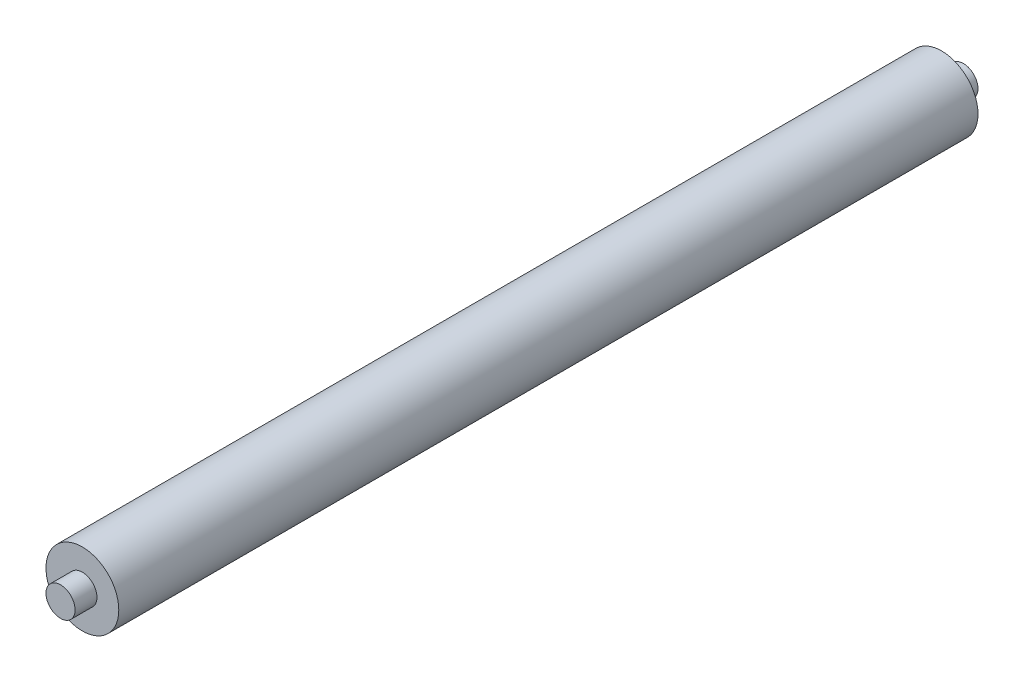
ISO-10303-21;
HEADER;
FILE_DESCRIPTION(('STEP AP214'),'2;1');
FILE_NAME('part.step','',(''),(''),'','','');
FILE_SCHEMA(('AUTOMOTIVE_DESIGN { 1 0 10303 214 1 1 1 1 }'));
ENDSEC;
DATA;
#1=APPLICATION_CONTEXT('core data for automotive mechanical design processes');
#2=APPLICATION_PROTOCOL_DEFINITION('international standard','automotive_design',2000,#1);
#3=PRODUCT_CONTEXT('',#1,'mechanical');
#4=PRODUCT('Part','Part','',(#3));
#5=PRODUCT_RELATED_PRODUCT_CATEGORY('part','',(#4));
#6=PRODUCT_DEFINITION_FORMATION('','',#4);
#7=PRODUCT_DEFINITION_CONTEXT('part definition',#1,'design');
#8=PRODUCT_DEFINITION('design','',#6,#7);
#9=PRODUCT_DEFINITION_SHAPE('','',#8);
#10=(LENGTH_UNIT() NAMED_UNIT(*) SI_UNIT(.MILLI.,.METRE.));
#11=(NAMED_UNIT(*) PLANE_ANGLE_UNIT() SI_UNIT($,.RADIAN.));
#12=(NAMED_UNIT(*) SI_UNIT($,.STERADIAN.) SOLID_ANGLE_UNIT());
#13=UNCERTAINTY_MEASURE_WITH_UNIT(LENGTH_MEASURE(1.E-05),#10,'distance_accuracy_value','');
#14=(GEOMETRIC_REPRESENTATION_CONTEXT(3) GLOBAL_UNCERTAINTY_ASSIGNED_CONTEXT((#13)) GLOBAL_UNIT_ASSIGNED_CONTEXT((#10,
#11,#12)) REPRESENTATION_CONTEXT('',''));
#15=CARTESIAN_POINT('',(0.,0.,0.));
#16=DIRECTION('',(0.,0.,1.));
#17=DIRECTION('',(1.,0.,0.));
#18=AXIS2_PLACEMENT_3D('',#15,#16,#17);
#19=CARTESIAN_POINT('',(0.,0.,-295.));
#20=DIRECTION('',(0.,0.,1.));
#21=DIRECTION('',(1.,0.,0.));
#22=AXIS2_PLACEMENT_3D('',#19,#20,#21);
#23=PLANE('',#22);
#24=CARTESIAN_POINT('',(0.,0.,-295.));
#25=DIRECTION('',(0.,0.,1.));
#26=DIRECTION('',(1.,0.,0.));
#27=AXIS2_PLACEMENT_3D('',#24,#25,#26);
#28=CIRCLE('',#27,10.);
#29=CARTESIAN_POINT('',(10.,0.,-295.));
#30=VERTEX_POINT('',#29);
#31=EDGE_CURVE('E65',#30,#30,#28,.T.);
#32=ORIENTED_EDGE('',*,*,#31,.T.);
#33=EDGE_LOOP('',(#32));
#34=FACE_BOUND('',#33,.T.);
#35=CARTESIAN_POINT('',(0.,0.,-295.));
#36=DIRECTION('',(0.,0.,1.));
#37=DIRECTION('',(1.,0.,0.));
#38=AXIS2_PLACEMENT_3D('',#35,#36,#37);
#39=CIRCLE('',#38,25.);
#40=CARTESIAN_POINT('',(25.,0.,-295.));
#41=VERTEX_POINT('',#40);
#42=EDGE_CURVE('E60',#41,#41,#39,.T.);
#43=ORIENTED_EDGE('',*,*,#42,.F.);
#44=EDGE_LOOP('',(#43));
#45=FACE_BOUND('',#44,.T.);
#46=ADVANCED_FACE('F49',(#34,#45),#23,.F.);
#47=CARTESIAN_POINT('',(0.,0.,295.));
#48=DIRECTION('',(0.,0.,-1.));
#49=DIRECTION('',(-1.,0.,0.));
#50=AXIS2_PLACEMENT_3D('',#47,#48,#49);
#51=CYLINDRICAL_SURFACE('',#50,25.);
#52=CARTESIAN_POINT('',(0.,0.,295.));
#53=DIRECTION('',(0.,0.,1.));
#54=DIRECTION('',(1.,0.,0.));
#55=AXIS2_PLACEMENT_3D('',#52,#53,#54);
#56=CIRCLE('',#55,25.);
#57=CARTESIAN_POINT('',(25.,0.,295.));
#58=VERTEX_POINT('',#57);
#59=EDGE_CURVE('E56',#58,#58,#56,.T.);
#60=ORIENTED_EDGE('',*,*,#59,.F.);
#61=EDGE_LOOP('',(#60));
#62=FACE_BOUND('',#61,.T.);
#63=ORIENTED_EDGE('',*,*,#42,.T.);
#64=EDGE_LOOP('',(#63));
#65=FACE_BOUND('',#64,.T.);
#66=ADVANCED_FACE('F51',(#62,#65),#51,.T.);
#67=CARTESIAN_POINT('',(0.,0.,295.));
#68=DIRECTION('',(0.,0.,1.));
#69=DIRECTION('',(1.,0.,0.));
#70=AXIS2_PLACEMENT_3D('',#67,#68,#69);
#71=PLANE('',#70);
#72=CARTESIAN_POINT('',(0.,0.,295.));
#73=DIRECTION('',(0.,0.,1.));
#74=DIRECTION('',(1.,0.,0.));
#75=AXIS2_PLACEMENT_3D('',#72,#73,#74);
#76=CIRCLE('',#75,10.);
#77=CARTESIAN_POINT('',(10.,0.,295.));
#78=VERTEX_POINT('',#77);
#79=EDGE_CURVE('E11',#78,#78,#76,.T.);
#80=ORIENTED_EDGE('',*,*,#79,.F.);
#81=EDGE_LOOP('',(#80));
#82=FACE_BOUND('',#81,.T.);
#83=ORIENTED_EDGE('',*,*,#59,.T.);
#84=EDGE_LOOP('',(#83));
#85=FACE_BOUND('',#84,.T.);
#86=ADVANCED_FACE('F88',(#82,#85),#71,.T.);
#87=CARTESIAN_POINT('',(0.,0.,310.));
#88=DIRECTION('',(0.,0.,1.));
#89=DIRECTION('',(1.,0.,0.));
#90=AXIS2_PLACEMENT_3D('',#87,#88,#89);
#91=PLANE('',#90);
#92=CARTESIAN_POINT('',(0.,0.,310.));
#93=DIRECTION('',(0.,0.,1.));
#94=DIRECTION('',(1.,0.,0.));
#95=AXIS2_PLACEMENT_3D('',#92,#93,#94);
#96=CIRCLE('',#95,10.);
#97=CARTESIAN_POINT('',(10.,0.,310.));
#98=VERTEX_POINT('',#97);
#99=EDGE_CURVE('E72',#98,#98,#96,.T.);
#100=ORIENTED_EDGE('',*,*,#99,.T.);
#101=EDGE_LOOP('',(#100));
#102=FACE_BOUND('',#101,.T.);
#103=ADVANCED_FACE('F76',(#102),#91,.T.);
#104=CARTESIAN_POINT('',(0.,0.,-310.));
#105=DIRECTION('',(0.,0.,1.));
#106=DIRECTION('',(1.,0.,0.));
#107=AXIS2_PLACEMENT_3D('',#104,#105,#106);
#108=CYLINDRICAL_SURFACE('',#107,10.);
#109=ORIENTED_EDGE('',*,*,#79,.T.);
#110=EDGE_LOOP('',(#109));
#111=FACE_BOUND('',#110,.T.);
#112=ORIENTED_EDGE('',*,*,#99,.F.);
#113=EDGE_LOOP('',(#112));
#114=FACE_BOUND('',#113,.T.);
#115=ADVANCED_FACE('F78',(#111,#114),#108,.T.);
#116=CARTESIAN_POINT('',(0.,0.,-310.));
#117=DIRECTION('',(0.,0.,1.));
#118=DIRECTION('',(1.,0.,0.));
#119=AXIS2_PLACEMENT_3D('',#116,#117,#118);
#120=CIRCLE('',#119,10.);
#121=CARTESIAN_POINT('',(10.,0.,-310.));
#122=VERTEX_POINT('',#121);
#123=EDGE_CURVE('E69',#122,#122,#120,.T.);
#124=ORIENTED_EDGE('',*,*,#123,.T.);
#125=EDGE_LOOP('',(#124));
#126=FACE_BOUND('',#125,.T.);
#127=ORIENTED_EDGE('',*,*,#31,.F.);
#128=EDGE_LOOP('',(#127));
#129=FACE_BOUND('',#128,.T.);
#130=ADVANCED_FACE('F80',(#126,#129),#108,.T.);
#131=CARTESIAN_POINT('',(0.,0.,-310.));
#132=DIRECTION('',(0.,0.,1.));
#133=DIRECTION('',(1.,0.,0.));
#134=AXIS2_PLACEMENT_3D('',#131,#132,#133);
#135=PLANE('',#134);
#136=ORIENTED_EDGE('',*,*,#123,.F.);
#137=EDGE_LOOP('',(#136));
#138=FACE_BOUND('',#137,.T.);
#139=ADVANCED_FACE('F86',(#138),#135,.F.);
#140=CLOSED_SHELL('',(#46,#66,#86,#103,#115,#130,#139));
#141=MANIFOLD_SOLID_BREP('B2',#140);
#142=ADVANCED_BREP_SHAPE_REPRESENTATION('',(#18,#141),#14);
#143=SHAPE_DEFINITION_REPRESENTATION(#9,#142);
ENDSEC;
END-ISO-10303-21;
